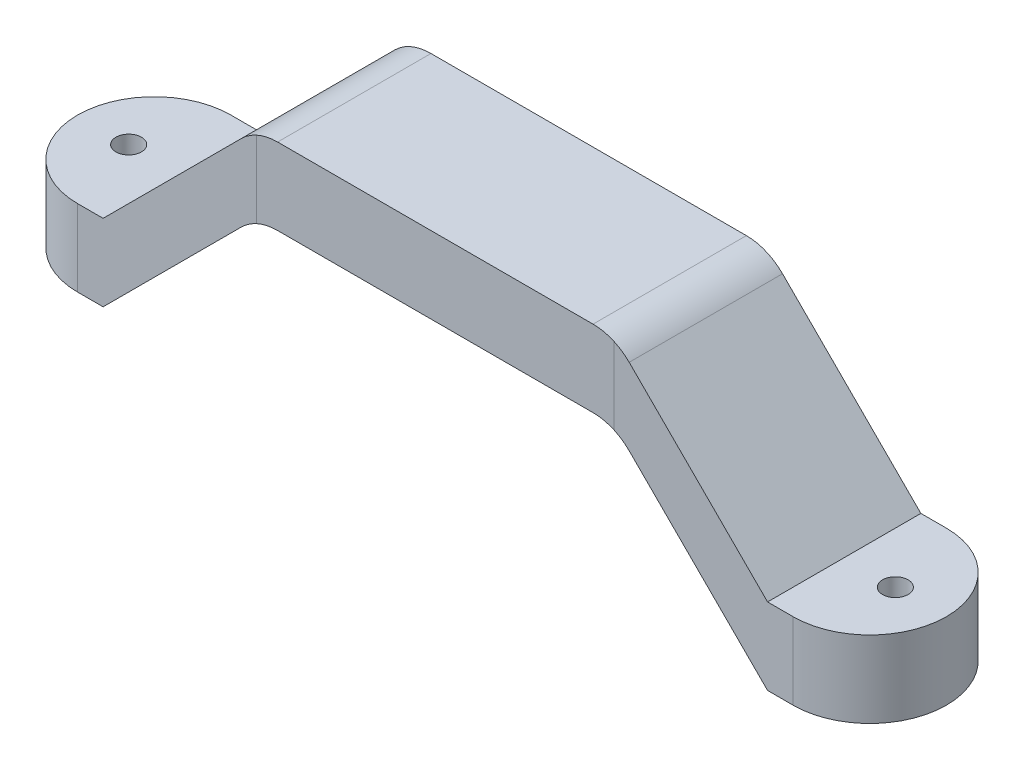
ISO-10303-21;
HEADER;
FILE_DESCRIPTION(('STEP AP214'),'2;1');
FILE_NAME('part.step','',(''),(''),'','','');
FILE_SCHEMA(('AUTOMOTIVE_DESIGN { 1 0 10303 214 1 1 1 1 }'));
ENDSEC;
DATA;
#1=APPLICATION_CONTEXT('core data for automotive mechanical design processes');
#2=APPLICATION_PROTOCOL_DEFINITION('international standard','automotive_design',2000,#1);
#3=PRODUCT_CONTEXT('',#1,'mechanical');
#4=PRODUCT('Part','Part','',(#3));
#5=PRODUCT_RELATED_PRODUCT_CATEGORY('part','',(#4));
#6=PRODUCT_DEFINITION_FORMATION('','',#4);
#7=PRODUCT_DEFINITION_CONTEXT('part definition',#1,'design');
#8=PRODUCT_DEFINITION('design','',#6,#7);
#9=PRODUCT_DEFINITION_SHAPE('','',#8);
#10=(LENGTH_UNIT() NAMED_UNIT(*) SI_UNIT(.MILLI.,.METRE.));
#11=(NAMED_UNIT(*) PLANE_ANGLE_UNIT() SI_UNIT($,.RADIAN.));
#12=(NAMED_UNIT(*) SI_UNIT($,.STERADIAN.) SOLID_ANGLE_UNIT());
#13=UNCERTAINTY_MEASURE_WITH_UNIT(LENGTH_MEASURE(1.E-05),#10,'distance_accuracy_value','');
#14=(GEOMETRIC_REPRESENTATION_CONTEXT(3) GLOBAL_UNCERTAINTY_ASSIGNED_CONTEXT((#13)) GLOBAL_UNIT_ASSIGNED_CONTEXT((#10,
#11,#12)) REPRESENTATION_CONTEXT('',''));
#15=CARTESIAN_POINT('',(0.,0.,0.));
#16=DIRECTION('',(0.,0.,1.));
#17=DIRECTION('',(1.,0.,0.));
#18=AXIS2_PLACEMENT_3D('',#15,#16,#17);
#19=CARTESIAN_POINT('',(38.1,28.575,-19.05));
#20=DIRECTION('',(0.,0.,-1.));
#21=DIRECTION('',(-1.,0.,0.));
#22=AXIS2_PLACEMENT_3D('',#19,#20,#21);
#23=PLANE('',#22);
#24=DIRECTION('',(1.,0.,0.));
#25=VECTOR('',#24,1.);
#26=CARTESIAN_POINT('',(38.1,47.625,-19.05));
#27=LINE('',#26,#25);
#28=CARTESIAN_POINT('',(43.3605122421383,47.625,-19.05));
#29=VERTEX_POINT('',#28);
#30=CARTESIAN_POINT('',(121.739487757862,47.625,-19.05));
#31=VERTEX_POINT('',#30);
#32=EDGE_CURVE('E300',#29,#31,#27,.T.);
#33=ORIENTED_EDGE('',*,*,#32,.T.);
#34=CARTESIAN_POINT('',(121.739487757862,34.925,-19.05));
#35=DIRECTION('',(0.,0.,-1.));
#36=DIRECTION('',(-1.,0.,0.));
#37=AXIS2_PLACEMENT_3D('',#34,#35,#36);
#38=CIRCLE('',#37,12.7);
#39=CARTESIAN_POINT('',(127.,46.4842824582806,-19.05));
#40=VERTEX_POINT('',#39);
#41=EDGE_CURVE('E335',#31,#40,#38,.T.);
#42=ORIENTED_EDGE('',*,*,#41,.T.);
#43=DIRECTION('',(0.,1.,0.));
#44=VECTOR('',#43,1.);
#45=CARTESIAN_POINT('',(127.,28.575,-19.05));
#46=LINE('',#45,#44);
#47=CARTESIAN_POINT('',(127.,27.4342824582806,-19.05));
#48=VERTEX_POINT('',#47);
#49=EDGE_CURVE('E214',#48,#40,#46,.T.);
#50=ORIENTED_EDGE('',*,*,#49,.F.);
#51=CARTESIAN_POINT('',(121.739487757862,15.875,-19.05));
#52=DIRECTION('',(0.,0.,-1.));
#53=DIRECTION('',(-1.,0.,0.));
#54=AXIS2_PLACEMENT_3D('',#51,#52,#53);
#55=CIRCLE('',#54,12.7);
#56=CARTESIAN_POINT('',(121.739487757862,28.575,-19.05));
#57=VERTEX_POINT('',#56);
#58=EDGE_CURVE('E367',#48,#57,#55,.F.);
#59=ORIENTED_EDGE('',*,*,#58,.T.);
#60=DIRECTION('',(1.,0.,0.));
#61=VECTOR('',#60,1.);
#62=CARTESIAN_POINT('',(38.1,28.575,-19.05));
#63=LINE('',#62,#61);
#64=CARTESIAN_POINT('',(43.3605122421383,28.575,-19.05));
#65=VERTEX_POINT('',#64);
#66=EDGE_CURVE('E269',#65,#57,#63,.T.);
#67=ORIENTED_EDGE('',*,*,#66,.F.);
#68=CARTESIAN_POINT('',(43.3605122421383,15.875,-19.05));
#69=DIRECTION('',(0.,0.,-1.));
#70=DIRECTION('',(-1.,0.,0.));
#71=AXIS2_PLACEMENT_3D('',#68,#69,#70);
#72=CIRCLE('',#71,12.7);
#73=CARTESIAN_POINT('',(38.1,27.4342824582806,-19.05));
#74=VERTEX_POINT('',#73);
#75=EDGE_CURVE('E377',#65,#74,#72,.F.);
#76=ORIENTED_EDGE('',*,*,#75,.T.);
#77=DIRECTION('',(0.,1.,0.));
#78=VECTOR('',#77,1.);
#79=CARTESIAN_POINT('',(38.1,28.575,-19.05));
#80=LINE('',#79,#78);
#81=CARTESIAN_POINT('',(38.1,46.4842824582806,-19.05));
#82=VERTEX_POINT('',#81);
#83=EDGE_CURVE('E68',#74,#82,#80,.T.);
#84=ORIENTED_EDGE('',*,*,#83,.T.);
#85=CARTESIAN_POINT('',(43.3605122421383,34.925,-19.05));
#86=DIRECTION('',(0.,0.,-1.));
#87=DIRECTION('',(-1.,0.,0.));
#88=AXIS2_PLACEMENT_3D('',#85,#86,#87);
#89=CIRCLE('',#88,12.7);
#90=EDGE_CURVE('E332',#82,#29,#89,.T.);
#91=ORIENTED_EDGE('',*,*,#90,.T.);
#92=EDGE_LOOP('',(#33,#42,#50,#59,#67,#76,#84,#91));
#93=FACE_BOUND('',#92,.T.);
#94=ADVANCED_FACE('F45',(#93),#23,.T.);
#95=CARTESIAN_POINT('',(38.1,47.625,19.05));
#96=DIRECTION('',(0.,1.,0.));
#97=DIRECTION('',(-1.,0.,0.));
#98=AXIS2_PLACEMENT_3D('',#95,#96,#97);
#99=PLANE('',#98);
#100=DIRECTION('',(1.,0.,0.));
#101=VECTOR('',#100,1.);
#102=CARTESIAN_POINT('',(38.1,47.625,19.05));
#103=LINE('',#102,#101);
#104=CARTESIAN_POINT('',(43.3605122421383,47.625,19.05));
#105=VERTEX_POINT('',#104);
#106=CARTESIAN_POINT('',(121.739487757862,47.625,19.05));
#107=VERTEX_POINT('',#106);
#108=EDGE_CURVE('E304',#105,#107,#103,.T.);
#109=ORIENTED_EDGE('',*,*,#108,.T.);
#110=DIRECTION('',(0.,0.,1.));
#111=VECTOR('',#110,1.);
#112=CARTESIAN_POINT('',(121.739487757862,47.625,19.05));
#113=LINE('',#112,#111);
#114=EDGE_CURVE('E329',#107,#31,#113,.F.);
#115=ORIENTED_EDGE('',*,*,#114,.T.);
#116=ORIENTED_EDGE('',*,*,#32,.F.);
#117=DIRECTION('',(0.,0.,1.));
#118=VECTOR('',#117,1.);
#119=CARTESIAN_POINT('',(43.3605122421383,47.625,19.05));
#120=LINE('',#119,#118);
#121=EDGE_CURVE('E325',#29,#105,#120,.T.);
#122=ORIENTED_EDGE('',*,*,#121,.T.);
#123=EDGE_LOOP('',(#109,#115,#116,#122));
#124=FACE_BOUND('',#123,.T.);
#125=ADVANCED_FACE('F414',(#124),#99,.T.);
#126=CARTESIAN_POINT('',(38.1,28.575,19.05));
#127=DIRECTION('',(0.,0.,1.));
#128=DIRECTION('',(1.,0.,0.));
#129=AXIS2_PLACEMENT_3D('',#126,#127,#128);
#130=PLANE('',#129);
#131=DIRECTION('',(0.,-1.,0.));
#132=VECTOR('',#131,1.);
#133=CARTESIAN_POINT('',(127.,28.575,19.05));
#134=LINE('',#133,#132);
#135=CARTESIAN_POINT('',(127.,46.4842824582806,19.05));
#136=VERTEX_POINT('',#135);
#137=CARTESIAN_POINT('',(127.,27.4342824582806,19.05));
#138=VERTEX_POINT('',#137);
#139=EDGE_CURVE('E218',#136,#138,#134,.T.);
#140=ORIENTED_EDGE('',*,*,#139,.F.);
#141=CARTESIAN_POINT('',(121.739487757862,34.925,19.05));
#142=DIRECTION('',(0.,0.,1.));
#143=DIRECTION('',(1.,0.,0.));
#144=AXIS2_PLACEMENT_3D('',#141,#142,#143);
#145=CIRCLE('',#144,12.7);
#146=EDGE_CURVE('E322',#136,#107,#145,.T.);
#147=ORIENTED_EDGE('',*,*,#146,.T.);
#148=ORIENTED_EDGE('',*,*,#108,.F.);
#149=CARTESIAN_POINT('',(43.3605122421383,34.925,19.05));
#150=DIRECTION('',(0.,0.,1.));
#151=DIRECTION('',(1.,0.,0.));
#152=AXIS2_PLACEMENT_3D('',#149,#150,#151);
#153=CIRCLE('',#152,12.7);
#154=CARTESIAN_POINT('',(38.1,46.4842824582806,19.05));
#155=VERTEX_POINT('',#154);
#156=EDGE_CURVE('E319',#105,#155,#153,.T.);
#157=ORIENTED_EDGE('',*,*,#156,.T.);
#158=DIRECTION('',(0.,-1.,0.));
#159=VECTOR('',#158,1.);
#160=CARTESIAN_POINT('',(38.1,28.575,19.05));
#161=LINE('',#160,#159);
#162=CARTESIAN_POINT('',(38.1,27.4342824582806,19.05));
#163=VERTEX_POINT('',#162);
#164=EDGE_CURVE('E60',#155,#163,#161,.T.);
#165=ORIENTED_EDGE('',*,*,#164,.T.);
#166=CARTESIAN_POINT('',(43.3605122421383,15.875,19.05));
#167=DIRECTION('',(0.,0.,1.));
#168=DIRECTION('',(1.,0.,0.));
#169=AXIS2_PLACEMENT_3D('',#166,#167,#168);
#170=CIRCLE('',#169,12.7);
#171=CARTESIAN_POINT('',(43.3605122421383,28.575,19.05));
#172=VERTEX_POINT('',#171);
#173=EDGE_CURVE('E11',#163,#172,#170,.F.);
#174=ORIENTED_EDGE('',*,*,#173,.T.);
#175=DIRECTION('',(1.,0.,0.));
#176=VECTOR('',#175,1.);
#177=CARTESIAN_POINT('',(38.1,28.575,19.05));
#178=LINE('',#177,#176);
#179=CARTESIAN_POINT('',(121.739487757862,28.575,19.05));
#180=VERTEX_POINT('',#179);
#181=EDGE_CURVE('E286',#172,#180,#178,.T.);
#182=ORIENTED_EDGE('',*,*,#181,.T.);
#183=CARTESIAN_POINT('',(121.739487757862,15.875,19.05));
#184=DIRECTION('',(0.,0.,1.));
#185=DIRECTION('',(1.,0.,0.));
#186=AXIS2_PLACEMENT_3D('',#183,#184,#185);
#187=CIRCLE('',#186,12.7);
#188=EDGE_CURVE('E370',#180,#138,#187,.F.);
#189=ORIENTED_EDGE('',*,*,#188,.T.);
#190=EDGE_LOOP('',(#140,#147,#148,#157,#165,#174,#182,#189));
#191=FACE_BOUND('',#190,.T.);
#192=ADVANCED_FACE('F394',(#191),#130,.T.);
#193=CARTESIAN_POINT('',(38.1,28.575,19.05));
#194=DIRECTION('',(0.,-1.,0.));
#195=DIRECTION('',(1.,0.,0.));
#196=AXIS2_PLACEMENT_3D('',#193,#194,#195);
#197=PLANE('',#196);
#198=ORIENTED_EDGE('',*,*,#66,.T.);
#199=DIRECTION('',(0.,0.,-1.));
#200=VECTOR('',#199,1.);
#201=CARTESIAN_POINT('',(121.739487757862,28.575,19.05));
#202=LINE('',#201,#200);
#203=EDGE_CURVE('E357',#57,#180,#202,.F.);
#204=ORIENTED_EDGE('',*,*,#203,.T.);
#205=ORIENTED_EDGE('',*,*,#181,.F.);
#206=DIRECTION('',(0.,0.,-1.));
#207=VECTOR('',#206,1.);
#208=CARTESIAN_POINT('',(43.3605122421383,28.575,-19.05));
#209=LINE('',#208,#207);
#210=EDGE_CURVE('E353',#172,#65,#209,.T.);
#211=ORIENTED_EDGE('',*,*,#210,.T.);
#212=EDGE_LOOP('',(#198,#204,#205,#211));
#213=FACE_BOUND('',#212,.T.);
#214=ADVANCED_FACE('F397',(#213),#197,.T.);
#215=CARTESIAN_POINT('',(0.,-9.525,-19.05));
#216=DIRECTION('',(0.,0.,-1.));
#217=DIRECTION('',(-1.,0.,0.));
#218=AXIS2_PLACEMENT_3D('',#215,#216,#217);
#219=PLANE('',#218);
#220=DIRECTION('',(0.707106781186547,0.707106781186548,0.));
#221=VECTOR('',#220,1.);
#222=CARTESIAN_POINT('',(0.,9.525,-19.05));
#223=LINE('',#222,#221);
#224=CARTESIAN_POINT('',(0.,9.525,-19.05));
#225=VERTEX_POINT('',#224);
#226=CARTESIAN_POINT('',(34.3802561210691,43.9052561210692,-19.05));
#227=VERTEX_POINT('',#226);
#228=EDGE_CURVE('E272',#225,#227,#223,.T.);
#229=ORIENTED_EDGE('',*,*,#228,.T.);
#230=CARTESIAN_POINT('',(43.3605122421383,34.925,-19.05));
#231=DIRECTION('',(0.,0.,-1.));
#232=DIRECTION('',(-1.,0.,0.));
#233=AXIS2_PLACEMENT_3D('',#230,#231,#232);
#234=CIRCLE('',#233,12.7);
#235=EDGE_CURVE('E346',#227,#82,#234,.T.);
#236=ORIENTED_EDGE('',*,*,#235,.T.);
#237=ORIENTED_EDGE('',*,*,#83,.F.);
#238=CARTESIAN_POINT('',(43.3605122421383,15.875,-19.05));
#239=DIRECTION('',(0.,0.,-1.));
#240=DIRECTION('',(-1.,0.,0.));
#241=AXIS2_PLACEMENT_3D('',#238,#239,#240);
#242=CIRCLE('',#241,12.7);
#243=CARTESIAN_POINT('',(34.3802561210691,24.8552561210692,-19.05));
#244=VERTEX_POINT('',#243);
#245=EDGE_CURVE('E380',#74,#244,#242,.F.);
#246=ORIENTED_EDGE('',*,*,#245,.T.);
#247=DIRECTION('',(0.707106781186547,0.707106781186548,0.));
#248=VECTOR('',#247,1.);
#249=CARTESIAN_POINT('',(0.,-9.525,-19.05));
#250=LINE('',#249,#248);
#251=CARTESIAN_POINT('',(0.,-9.525,-19.05));
#252=VERTEX_POINT('',#251);
#253=EDGE_CURVE('E273',#252,#244,#250,.T.);
#254=ORIENTED_EDGE('',*,*,#253,.F.);
#255=DIRECTION('',(-1.,0.,0.));
#256=VECTOR('',#255,1.);
#257=CARTESIAN_POINT('',(0.,-9.525,-19.05));
#258=LINE('',#257,#256);
#259=CARTESIAN_POINT('',(-6.35,-9.525,-19.05));
#260=VERTEX_POINT('',#259);
#261=EDGE_CURVE('E240',#252,#260,#258,.T.);
#262=ORIENTED_EDGE('',*,*,#261,.T.);
#263=DIRECTION('',(0.,-1.,0.));
#264=VECTOR('',#263,1.);
#265=CARTESIAN_POINT('',(-6.35,9.525,-19.05));
#266=LINE('',#265,#264);
#267=CARTESIAN_POINT('',(-6.35,9.525,-19.05));
#268=VERTEX_POINT('',#267);
#269=EDGE_CURVE('E265',#268,#260,#266,.T.);
#270=ORIENTED_EDGE('',*,*,#269,.F.);
#271=DIRECTION('',(-1.,0.,0.));
#272=VECTOR('',#271,1.);
#273=CARTESIAN_POINT('',(0.,9.525,-19.05));
#274=LINE('',#273,#272);
#275=EDGE_CURVE('E244',#225,#268,#274,.T.);
#276=ORIENTED_EDGE('',*,*,#275,.F.);
#277=EDGE_LOOP('',(#229,#236,#237,#246,#254,#262,#270,#276));
#278=FACE_BOUND('',#277,.T.);
#279=ADVANCED_FACE('F445',(#278),#219,.T.);
#280=CARTESIAN_POINT('',(0.,9.525,19.05));
#281=DIRECTION('',(-0.707106781186548,0.707106781186547,0.));
#282=DIRECTION('',(-0.707106781186547,-0.707106781186548,0.));
#283=AXIS2_PLACEMENT_3D('',#280,#281,#282);
#284=PLANE('',#283);
#285=DIRECTION('',(0.707106781186547,0.707106781186548,0.));
#286=VECTOR('',#285,1.);
#287=CARTESIAN_POINT('',(0.,9.525,19.05));
#288=LINE('',#287,#286);
#289=CARTESIAN_POINT('',(0.,9.525,19.05));
#290=VERTEX_POINT('',#289);
#291=CARTESIAN_POINT('',(34.3802561210691,43.9052561210692,19.05));
#292=VERTEX_POINT('',#291);
#293=EDGE_CURVE('E277',#290,#292,#288,.T.);
#294=ORIENTED_EDGE('',*,*,#293,.T.);
#295=DIRECTION('',(0.,0.,1.));
#296=VECTOR('',#295,1.);
#297=CARTESIAN_POINT('',(34.3802561210691,43.9052561210692,19.05));
#298=LINE('',#297,#296);
#299=EDGE_CURVE('E343',#292,#227,#298,.F.);
#300=ORIENTED_EDGE('',*,*,#299,.T.);
#301=ORIENTED_EDGE('',*,*,#228,.F.);
#302=DIRECTION('',(0.,0.,1.));
#303=VECTOR('',#302,1.);
#304=CARTESIAN_POINT('',(0.,9.525,19.05));
#305=LINE('',#304,#303);
#306=EDGE_CURVE('E282',#225,#290,#305,.T.);
#307=ORIENTED_EDGE('',*,*,#306,.T.);
#308=EDGE_LOOP('',(#294,#300,#301,#307));
#309=FACE_BOUND('',#308,.T.);
#310=ADVANCED_FACE('F425',(#309),#284,.T.);
#311=CARTESIAN_POINT('',(0.,-9.525,19.05));
#312=DIRECTION('',(0.,0.,1.));
#313=DIRECTION('',(1.,0.,0.));
#314=AXIS2_PLACEMENT_3D('',#311,#312,#313);
#315=PLANE('',#314);
#316=ORIENTED_EDGE('',*,*,#164,.F.);
#317=CARTESIAN_POINT('',(43.3605122421383,34.925,19.05));
#318=DIRECTION('',(0.,0.,1.));
#319=DIRECTION('',(1.,0.,0.));
#320=AXIS2_PLACEMENT_3D('',#317,#318,#319);
#321=CIRCLE('',#320,12.7);
#322=EDGE_CURVE('E340',#155,#292,#321,.T.);
#323=ORIENTED_EDGE('',*,*,#322,.T.);
#324=ORIENTED_EDGE('',*,*,#293,.F.);
#325=DIRECTION('',(1.,0.,0.));
#326=VECTOR('',#325,1.);
#327=CARTESIAN_POINT('',(0.,9.525,19.05));
#328=LINE('',#327,#326);
#329=CARTESIAN_POINT('',(-6.34999999999999,9.525,19.05));
#330=VERTEX_POINT('',#329);
#331=EDGE_CURVE('E251',#330,#290,#328,.T.);
#332=ORIENTED_EDGE('',*,*,#331,.F.);
#333=DIRECTION('',(0.,-1.,0.));
#334=VECTOR('',#333,1.);
#335=CARTESIAN_POINT('',(-6.34999999999999,9.525,19.05));
#336=LINE('',#335,#334);
#337=CARTESIAN_POINT('',(-6.34999999999999,-9.525,19.05));
#338=VERTEX_POINT('',#337);
#339=EDGE_CURVE('E254',#330,#338,#336,.T.);
#340=ORIENTED_EDGE('',*,*,#339,.T.);
#341=DIRECTION('',(1.,0.,0.));
#342=VECTOR('',#341,1.);
#343=CARTESIAN_POINT('',(0.,-9.525,19.05));
#344=LINE('',#343,#342);
#345=CARTESIAN_POINT('',(0.,-9.525,19.05));
#346=VERTEX_POINT('',#345);
#347=EDGE_CURVE('E248',#338,#346,#344,.T.);
#348=ORIENTED_EDGE('',*,*,#347,.T.);
#349=DIRECTION('',(0.707106781186547,0.707106781186548,0.));
#350=VECTOR('',#349,1.);
#351=CARTESIAN_POINT('',(0.,-9.525,19.05));
#352=LINE('',#351,#350);
#353=CARTESIAN_POINT('',(34.3802561210691,24.8552561210692,19.05));
#354=VERTEX_POINT('',#353);
#355=EDGE_CURVE('E292',#346,#354,#352,.T.);
#356=ORIENTED_EDGE('',*,*,#355,.T.);
#357=CARTESIAN_POINT('',(43.3605122421383,15.875,19.05));
#358=DIRECTION('',(0.,0.,1.));
#359=DIRECTION('',(1.,0.,0.));
#360=AXIS2_PLACEMENT_3D('',#357,#358,#359);
#361=CIRCLE('',#360,12.7);
#362=EDGE_CURVE('E54',#354,#163,#361,.F.);
#363=ORIENTED_EDGE('',*,*,#362,.T.);
#364=EDGE_LOOP('',(#316,#323,#324,#332,#340,#348,#356,#363));
#365=FACE_BOUND('',#364,.T.);
#366=ADVANCED_FACE('F386',(#365),#315,.T.);
#367=CARTESIAN_POINT('',(0.,-9.525,19.05));
#368=DIRECTION('',(0.707106781186548,-0.707106781186547,0.));
#369=DIRECTION('',(0.707106781186547,0.707106781186548,0.));
#370=AXIS2_PLACEMENT_3D('',#367,#368,#369);
#371=PLANE('',#370);
#372=ORIENTED_EDGE('',*,*,#253,.T.);
#373=DIRECTION('',(0.,0.,-1.));
#374=VECTOR('',#373,1.);
#375=CARTESIAN_POINT('',(34.3802561210691,24.8552561210692,19.05));
#376=LINE('',#375,#374);
#377=EDGE_CURVE('E360',#244,#354,#376,.F.);
#378=ORIENTED_EDGE('',*,*,#377,.T.);
#379=ORIENTED_EDGE('',*,*,#355,.F.);
#380=DIRECTION('',(0.,0.,-1.));
#381=VECTOR('',#380,1.);
#382=CARTESIAN_POINT('',(0.,-9.525,19.05));
#383=LINE('',#382,#381);
#384=EDGE_CURVE('E281',#346,#252,#383,.T.);
#385=ORIENTED_EDGE('',*,*,#384,.T.);
#386=EDGE_LOOP('',(#372,#378,#379,#385));
#387=FACE_BOUND('',#386,.T.);
#388=ADVANCED_FACE('F443',(#387),#371,.T.);
#389=CARTESIAN_POINT('',(-6.35,9.525,0.));
#390=DIRECTION('',(0.,-1.,0.));
#391=DIRECTION('',(0.,0.,-1.));
#392=AXIS2_PLACEMENT_3D('',#389,#390,#391);
#393=PLANE('',#392);
#394=ORIENTED_EDGE('',*,*,#306,.F.);
#395=ORIENTED_EDGE('',*,*,#275,.T.);
#396=CARTESIAN_POINT('',(-6.35,9.525,0.));
#397=DIRECTION('',(0.,1.,0.));
#398=DIRECTION('',(0.,0.,-1.));
#399=AXIS2_PLACEMENT_3D('',#396,#397,#398);
#400=CIRCLE('',#399,19.05);
#401=EDGE_CURVE('E247',#268,#330,#400,.T.);
#402=ORIENTED_EDGE('',*,*,#401,.T.);
#403=ORIENTED_EDGE('',*,*,#331,.T.);
#404=EDGE_LOOP('',(#394,#395,#402,#403));
#405=FACE_BOUND('',#404,.T.);
#406=CARTESIAN_POINT('',(-12.7,9.525,0.));
#407=DIRECTION('',(0.,1.,0.));
#408=DIRECTION('',(0.,0.,1.));
#409=AXIS2_PLACEMENT_3D('',#406,#407,#408);
#410=CIRCLE('',#409,3.175);
#411=CARTESIAN_POINT('',(-12.7,9.525,-3.175));
#412=VERTEX_POINT('',#411);
#413=EDGE_CURVE('E236',#412,#412,#410,.T.);
#414=ORIENTED_EDGE('',*,*,#413,.F.);
#415=EDGE_LOOP('',(#414));
#416=FACE_BOUND('',#415,.T.);
#417=ADVANCED_FACE('F429',(#405,#416),#393,.F.);
#418=CARTESIAN_POINT('',(-6.35,-9.525,0.));
#419=DIRECTION('',(0.,-1.,0.));
#420=DIRECTION('',(0.,0.,-1.));
#421=AXIS2_PLACEMENT_3D('',#418,#419,#420);
#422=PLANE('',#421);
#423=ORIENTED_EDGE('',*,*,#384,.F.);
#424=ORIENTED_EDGE('',*,*,#347,.F.);
#425=CARTESIAN_POINT('',(-6.35,-9.525,0.));
#426=DIRECTION('',(0.,1.,0.));
#427=DIRECTION('',(0.,0.,-1.));
#428=AXIS2_PLACEMENT_3D('',#425,#426,#427);
#429=CIRCLE('',#428,19.05);
#430=EDGE_CURVE('E257',#260,#338,#429,.T.);
#431=ORIENTED_EDGE('',*,*,#430,.F.);
#432=ORIENTED_EDGE('',*,*,#261,.F.);
#433=EDGE_LOOP('',(#423,#424,#431,#432));
#434=FACE_BOUND('',#433,.T.);
#435=CARTESIAN_POINT('',(-12.7,-9.525,0.));
#436=DIRECTION('',(0.,1.,0.));
#437=DIRECTION('',(0.,0.,1.));
#438=AXIS2_PLACEMENT_3D('',#435,#436,#437);
#439=CIRCLE('',#438,3.175);
#440=CARTESIAN_POINT('',(-12.7,-9.525,-3.175));
#441=VERTEX_POINT('',#440);
#442=EDGE_CURVE('E233',#441,#441,#439,.T.);
#443=ORIENTED_EDGE('',*,*,#442,.T.);
#444=EDGE_LOOP('',(#443));
#445=FACE_BOUND('',#444,.T.);
#446=ADVANCED_FACE('F439',(#434,#445),#422,.T.);
#447=CARTESIAN_POINT('',(-6.35,9.525,0.));
#448=DIRECTION('',(0.,-1.,0.));
#449=DIRECTION('',(0.,0.,-1.));
#450=AXIS2_PLACEMENT_3D('',#447,#448,#449);
#451=CYLINDRICAL_SURFACE('',#450,19.05);
#452=ORIENTED_EDGE('',*,*,#430,.T.);
#453=ORIENTED_EDGE('',*,*,#339,.F.);
#454=ORIENTED_EDGE('',*,*,#401,.F.);
#455=ORIENTED_EDGE('',*,*,#269,.T.);
#456=EDGE_LOOP('',(#452,#453,#454,#455));
#457=FACE_BOUND('',#456,.T.);
#458=ADVANCED_FACE('F446',(#457),#451,.T.);
#459=CARTESIAN_POINT('',(-12.7,9.525,0.));
#460=DIRECTION('',(0.,-1.,0.));
#461=DIRECTION('',(0.,0.,-1.));
#462=AXIS2_PLACEMENT_3D('',#459,#460,#461);
#463=CYLINDRICAL_SURFACE('',#462,3.175);
#464=CARTESIAN_POINT('',(-12.7,9.525,-3.175));
#465=CARTESIAN_POINT('',(-12.7,9.3265625,-3.175));
#466=CARTESIAN_POINT('',(-12.7,9.128125,-3.175));
#467=CARTESIAN_POINT('',(-12.7,8.73125,-3.175));
#468=CARTESIAN_POINT('',(-12.7,8.5328125,-3.175));
#469=CARTESIAN_POINT('',(-12.7,8.1359375,-3.175));
#470=CARTESIAN_POINT('',(-12.7,7.9375,-3.175));
#471=CARTESIAN_POINT('',(-12.7,7.540625,-3.175));
#472=CARTESIAN_POINT('',(-12.7,7.3421875,-3.175));
#473=CARTESIAN_POINT('',(-12.7,6.9453125,-3.175));
#474=CARTESIAN_POINT('',(-12.7,6.746875,-3.175));
#475=CARTESIAN_POINT('',(-12.7,6.35,-3.175));
#476=CARTESIAN_POINT('',(-12.7,6.1515625,-3.175));
#477=CARTESIAN_POINT('',(-12.7,5.7546875,-3.175));
#478=CARTESIAN_POINT('',(-12.7,5.55625,-3.175));
#479=CARTESIAN_POINT('',(-12.7,5.159375,-3.175));
#480=CARTESIAN_POINT('',(-12.7,4.9609375,-3.175));
#481=CARTESIAN_POINT('',(-12.7,4.5640625,-3.175));
#482=CARTESIAN_POINT('',(-12.7,4.365625,-3.175));
#483=CARTESIAN_POINT('',(-12.7,3.96875,-3.175));
#484=CARTESIAN_POINT('',(-12.7,3.7703125,-3.175));
#485=CARTESIAN_POINT('',(-12.7,3.3734375,-3.175));
#486=CARTESIAN_POINT('',(-12.7,3.175,-3.175));
#487=CARTESIAN_POINT('',(-12.7,2.778125,-3.175));
#488=CARTESIAN_POINT('',(-12.7,2.5796875,-3.175));
#489=CARTESIAN_POINT('',(-12.7,2.1828125,-3.175));
#490=CARTESIAN_POINT('',(-12.7,1.984375,-3.175));
#491=CARTESIAN_POINT('',(-12.7,1.5875,-3.175));
#492=CARTESIAN_POINT('',(-12.7,1.3890625,-3.175));
#493=CARTESIAN_POINT('',(-12.7,0.992187499999997,-3.175));
#494=CARTESIAN_POINT('',(-12.7,0.793749999999997,-3.175));
#495=CARTESIAN_POINT('',(-12.7,0.396874999999997,-3.175));
#496=CARTESIAN_POINT('',(-12.7,0.198437499999997,-3.175));
#497=CARTESIAN_POINT('',(-12.7,-0.198437500000004,-3.175));
#498=CARTESIAN_POINT('',(-12.7,-0.396875000000004,-3.175));
#499=CARTESIAN_POINT('',(-12.7,-0.793750000000004,-3.175));
#500=CARTESIAN_POINT('',(-12.7,-0.992187500000004,-3.175));
#501=CARTESIAN_POINT('',(-12.7,-1.3890625,-3.175));
#502=CARTESIAN_POINT('',(-12.7,-1.5875,-3.175));
#503=CARTESIAN_POINT('',(-12.7,-1.984375,-3.175));
#504=CARTESIAN_POINT('',(-12.7,-2.1828125,-3.175));
#505=CARTESIAN_POINT('',(-12.7,-2.5796875,-3.175));
#506=CARTESIAN_POINT('',(-12.7,-2.778125,-3.175));
#507=CARTESIAN_POINT('',(-12.7,-3.175,-3.175));
#508=CARTESIAN_POINT('',(-12.7,-3.3734375,-3.175));
#509=CARTESIAN_POINT('',(-12.7,-3.7703125,-3.175));
#510=CARTESIAN_POINT('',(-12.7,-3.96875,-3.175));
#511=CARTESIAN_POINT('',(-12.7,-4.365625,-3.175));
#512=CARTESIAN_POINT('',(-12.7,-4.5640625,-3.175));
#513=CARTESIAN_POINT('',(-12.7,-4.9609375,-3.175));
#514=CARTESIAN_POINT('',(-12.7,-5.15937500000001,-3.175));
#515=CARTESIAN_POINT('',(-12.7,-5.55625,-3.175));
#516=CARTESIAN_POINT('',(-12.7,-5.75468750000001,-3.175));
#517=CARTESIAN_POINT('',(-12.7,-6.1515625,-3.175));
#518=CARTESIAN_POINT('',(-12.7,-6.35,-3.175));
#519=CARTESIAN_POINT('',(-12.7,-6.746875,-3.175));
#520=CARTESIAN_POINT('',(-12.7,-6.9453125,-3.175));
#521=CARTESIAN_POINT('',(-12.7,-7.3421875,-3.175));
#522=CARTESIAN_POINT('',(-12.7,-7.540625,-3.175));
#523=CARTESIAN_POINT('',(-12.7,-7.9375,-3.175));
#524=CARTESIAN_POINT('',(-12.7,-8.1359375,-3.175));
#525=CARTESIAN_POINT('',(-12.7,-8.5328125,-3.175));
#526=CARTESIAN_POINT('',(-12.7,-8.73125,-3.175));
#527=CARTESIAN_POINT('',(-12.7,-9.128125,-3.175));
#528=CARTESIAN_POINT('',(-12.7,-9.3265625,-3.175));
#529=CARTESIAN_POINT('',(-12.7,-9.525,-3.175));
#530=B_SPLINE_CURVE_WITH_KNOTS('',3,(#464,#465,#466,#467,#468,#469,#470,#471,#472,#473,#474,
#475,#476,#477,#478,#479,#480,#481,#482,#483,#484,#485,#486,#487,#488,#489,#490,#491,#492,#493,
#494,#495,#496,#497,#498,#499,#500,#501,#502,#503,#504,#505,#506,#507,#508,#509,#510,#511,#512,
#513,#514,#515,#516,#517,#518,#519,#520,#521,#522,#523,#524,#525,#526,#527,#528,#529),
.UNSPECIFIED.,.F.,.F.,(4,2,2,2,2,2,2,2,2,2,2,2,2,2,2,2,2,2,2,2,2,2,2,2,2,2,2,2,2,2,2,2,4),(0.,
0.595312499999999,1.190625,1.7859375,2.38125,2.9765625,3.571875,4.1671875,4.7625,5.3578125,
5.953125,6.5484375,7.14375,7.7390625,8.334375,8.9296875,9.525,10.1203125,10.715625,11.3109375,
11.90625,12.5015625,13.096875,13.6921875,14.2875,14.8828125,15.478125,16.0734375,16.66875,
17.2640625,17.859375,18.4546875,19.05),.UNSPECIFIED.);
#531=EDGE_CURVE('BSEAM448',#412,#441,#530,.T.);
#532=ORIENTED_EDGE('',*,*,#413,.T.);
#533=ORIENTED_EDGE('',*,*,#442,.F.);
#534=ORIENTED_EDGE('',*,*,#531,.T.);
#535=ORIENTED_EDGE('',*,*,#531,.F.);
#536=EDGE_LOOP('',(#532,#534,#533,#535));
#537=FACE_BOUND('',#536,.T.);
#538=ADVANCED_FACE('F448',(#537),#463,.F.);
#539=CARTESIAN_POINT('',(165.1,-9.525,-19.05));
#540=DIRECTION('',(0.,0.,-1.));
#541=DIRECTION('',(1.,0.,0.));
#542=AXIS2_PLACEMENT_3D('',#539,#540,#541);
#543=PLANE('',#542);
#544=ORIENTED_EDGE('',*,*,#49,.T.);
#545=CARTESIAN_POINT('',(121.739487757862,34.925,-19.05));
#546=DIRECTION('',(0.,0.,-1.));
#547=DIRECTION('',(-1.,0.,0.));
#548=AXIS2_PLACEMENT_3D('',#545,#546,#547);
#549=CIRCLE('',#548,12.7);
#550=CARTESIAN_POINT('',(130.719743878931,43.9052561210691,-19.05));
#551=VERTEX_POINT('',#550);
#552=EDGE_CURVE('E212',#40,#551,#549,.T.);
#553=ORIENTED_EDGE('',*,*,#552,.T.);
#554=DIRECTION('',(-0.707106781186547,0.707106781186548,0.));
#555=VECTOR('',#554,1.);
#556=CARTESIAN_POINT('',(165.1,9.525,-19.05));
#557=LINE('',#556,#555);
#558=CARTESIAN_POINT('',(165.1,9.525,-19.05));
#559=VERTEX_POINT('',#558);
#560=EDGE_CURVE('E188',#559,#551,#557,.T.);
#561=ORIENTED_EDGE('',*,*,#560,.F.);
#562=DIRECTION('',(1.,0.,0.));
#563=VECTOR('',#562,1.);
#564=CARTESIAN_POINT('',(165.1,9.525,-19.05));
#565=LINE('',#564,#563);
#566=CARTESIAN_POINT('',(171.45,9.525,-19.05));
#567=VERTEX_POINT('',#566);
#568=EDGE_CURVE('E199',#559,#567,#565,.T.);
#569=ORIENTED_EDGE('',*,*,#568,.T.);
#570=DIRECTION('',(0.,-1.,0.));
#571=VECTOR('',#570,1.);
#572=CARTESIAN_POINT('',(171.45,9.525,-19.05));
#573=LINE('',#572,#571);
#574=CARTESIAN_POINT('',(171.45,-9.525,-19.05));
#575=VERTEX_POINT('',#574);
#576=EDGE_CURVE('E196',#567,#575,#573,.T.);
#577=ORIENTED_EDGE('',*,*,#576,.T.);
#578=DIRECTION('',(1.,0.,0.));
#579=VECTOR('',#578,1.);
#580=CARTESIAN_POINT('',(165.1,-9.525,-19.05));
#581=LINE('',#580,#579);
#582=CARTESIAN_POINT('',(165.1,-9.525,-19.05));
#583=VERTEX_POINT('',#582);
#584=EDGE_CURVE('E684',#583,#575,#581,.T.);
#585=ORIENTED_EDGE('',*,*,#584,.F.);
#586=DIRECTION('',(-0.707106781186547,0.707106781186548,0.));
#587=VECTOR('',#586,1.);
#588=CARTESIAN_POINT('',(165.1,-9.525,-19.05));
#589=LINE('',#588,#587);
#590=CARTESIAN_POINT('',(130.719743878931,24.8552561210691,-19.05));
#591=VERTEX_POINT('',#590);
#592=EDGE_CURVE('E220',#583,#591,#589,.T.);
#593=ORIENTED_EDGE('',*,*,#592,.T.);
#594=CARTESIAN_POINT('',(121.739487757862,15.875,-19.05));
#595=DIRECTION('',(0.,0.,-1.));
#596=DIRECTION('',(-1.,0.,0.));
#597=AXIS2_PLACEMENT_3D('',#594,#595,#596);
#598=CIRCLE('',#597,12.7);
#599=EDGE_CURVE('E363',#591,#48,#598,.F.);
#600=ORIENTED_EDGE('',*,*,#599,.T.);
#601=EDGE_LOOP('',(#544,#553,#561,#569,#577,#585,#593,#600));
#602=FACE_BOUND('',#601,.T.);
#603=ADVANCED_FACE('F210',(#602),#543,.T.);
#604=CARTESIAN_POINT('',(165.1,9.525,19.05));
#605=DIRECTION('',(0.707106781186548,0.707106781186547,0.));
#606=DIRECTION('',(0.707106781186547,-0.707106781186548,0.));
#607=AXIS2_PLACEMENT_3D('',#604,#605,#606);
#608=PLANE('',#607);
#609=ORIENTED_EDGE('',*,*,#560,.T.);
#610=DIRECTION('',(0.,0.,1.));
#611=VECTOR('',#610,1.);
#612=CARTESIAN_POINT('',(130.719743878931,43.9052561210691,19.05));
#613=LINE('',#612,#611);
#614=CARTESIAN_POINT('',(130.719743878931,43.9052561210691,19.05));
#615=VERTEX_POINT('',#614);
#616=EDGE_CURVE('E296',#551,#615,#613,.T.);
#617=ORIENTED_EDGE('',*,*,#616,.T.);
#618=DIRECTION('',(-0.707106781186547,0.707106781186548,0.));
#619=VECTOR('',#618,1.);
#620=CARTESIAN_POINT('',(165.1,9.525,19.05));
#621=LINE('',#620,#619);
#622=CARTESIAN_POINT('',(165.1,9.525,19.05));
#623=VERTEX_POINT('',#622);
#624=EDGE_CURVE('E191',#623,#615,#621,.T.);
#625=ORIENTED_EDGE('',*,*,#624,.F.);
#626=DIRECTION('',(0.,0.,1.));
#627=VECTOR('',#626,1.);
#628=CARTESIAN_POINT('',(165.1,9.525,19.05));
#629=LINE('',#628,#627);
#630=EDGE_CURVE('E183',#559,#623,#629,.T.);
#631=ORIENTED_EDGE('',*,*,#630,.F.);
#632=EDGE_LOOP('',(#609,#617,#625,#631));
#633=FACE_BOUND('',#632,.T.);
#634=ADVANCED_FACE('F185',(#633),#608,.T.);
#635=CARTESIAN_POINT('',(165.1,-9.525,19.05));
#636=DIRECTION('',(0.,0.,1.));
#637=DIRECTION('',(-1.,0.,0.));
#638=AXIS2_PLACEMENT_3D('',#635,#636,#637);
#639=PLANE('',#638);
#640=ORIENTED_EDGE('',*,*,#624,.T.);
#641=CARTESIAN_POINT('',(121.739487757862,34.925,19.05));
#642=DIRECTION('',(0.,0.,1.));
#643=DIRECTION('',(1.,0.,0.));
#644=AXIS2_PLACEMENT_3D('',#641,#642,#643);
#645=CIRCLE('',#644,12.7);
#646=EDGE_CURVE('E316',#615,#136,#645,.T.);
#647=ORIENTED_EDGE('',*,*,#646,.T.);
#648=ORIENTED_EDGE('',*,*,#139,.T.);
#649=CARTESIAN_POINT('',(121.739487757862,15.875,19.05));
#650=DIRECTION('',(0.,0.,1.));
#651=DIRECTION('',(1.,0.,0.));
#652=AXIS2_PLACEMENT_3D('',#649,#650,#651);
#653=CIRCLE('',#652,12.7);
#654=CARTESIAN_POINT('',(130.719743878931,24.8552561210691,19.05));
#655=VERTEX_POINT('',#654);
#656=EDGE_CURVE('E374',#138,#655,#653,.F.);
#657=ORIENTED_EDGE('',*,*,#656,.T.);
#658=DIRECTION('',(-0.707106781186547,0.707106781186548,0.));
#659=VECTOR('',#658,1.);
#660=CARTESIAN_POINT('',(165.1,-9.525,19.05));
#661=LINE('',#660,#659);
#662=CARTESIAN_POINT('',(165.1,-9.525,19.05));
#663=VERTEX_POINT('',#662);
#664=EDGE_CURVE('E229',#663,#655,#661,.T.);
#665=ORIENTED_EDGE('',*,*,#664,.F.);
#666=DIRECTION('',(-1.,0.,0.));
#667=VECTOR('',#666,1.);
#668=CARTESIAN_POINT('',(165.1,-9.525,19.05));
#669=LINE('',#668,#667);
#670=CARTESIAN_POINT('',(171.45,-9.525,19.05));
#671=VERTEX_POINT('',#670);
#672=EDGE_CURVE('E207',#671,#663,#669,.T.);
#673=ORIENTED_EDGE('',*,*,#672,.F.);
#674=DIRECTION('',(0.,-1.,0.));
#675=VECTOR('',#674,1.);
#676=CARTESIAN_POINT('',(171.45,9.525,19.05));
#677=LINE('',#676,#675);
#678=CARTESIAN_POINT('',(171.45,9.525,19.05));
#679=VERTEX_POINT('',#678);
#680=EDGE_CURVE('E676',#679,#671,#677,.T.);
#681=ORIENTED_EDGE('',*,*,#680,.F.);
#682=DIRECTION('',(-1.,0.,0.));
#683=VECTOR('',#682,1.);
#684=CARTESIAN_POINT('',(165.1,9.525,19.05));
#685=LINE('',#684,#683);
#686=EDGE_CURVE('E673',#679,#623,#685,.T.);
#687=ORIENTED_EDGE('',*,*,#686,.T.);
#688=EDGE_LOOP('',(#640,#647,#648,#657,#665,#673,#681,#687));
#689=FACE_BOUND('',#688,.T.);
#690=ADVANCED_FACE('F552',(#689),#639,.T.);
#691=CARTESIAN_POINT('',(165.1,-9.525,19.05));
#692=DIRECTION('',(-0.707106781186548,-0.707106781186547,0.));
#693=DIRECTION('',(-0.707106781186547,0.707106781186548,0.));
#694=AXIS2_PLACEMENT_3D('',#691,#692,#693);
#695=PLANE('',#694);
#696=ORIENTED_EDGE('',*,*,#664,.T.);
#697=DIRECTION('',(0.,0.,-1.));
#698=VECTOR('',#697,1.);
#699=CARTESIAN_POINT('',(130.719743878931,24.8552561210691,-19.05));
#700=LINE('',#699,#698);
#701=EDGE_CURVE('E349',#655,#591,#700,.T.);
#702=ORIENTED_EDGE('',*,*,#701,.T.);
#703=ORIENTED_EDGE('',*,*,#592,.F.);
#704=DIRECTION('',(0.,0.,-1.));
#705=VECTOR('',#704,1.);
#706=CARTESIAN_POINT('',(165.1,-9.525,19.05));
#707=LINE('',#706,#705);
#708=EDGE_CURVE('E195',#663,#583,#707,.T.);
#709=ORIENTED_EDGE('',*,*,#708,.F.);
#710=EDGE_LOOP('',(#696,#702,#703,#709));
#711=FACE_BOUND('',#710,.T.);
#712=ADVANCED_FACE('F543',(#711),#695,.T.);
#713=CARTESIAN_POINT('',(171.45,9.525,0.));
#714=DIRECTION('',(0.,-1.,0.));
#715=DIRECTION('',(0.,0.,-1.));
#716=AXIS2_PLACEMENT_3D('',#713,#714,#715);
#717=PLANE('',#716);
#718=ORIENTED_EDGE('',*,*,#630,.T.);
#719=ORIENTED_EDGE('',*,*,#686,.F.);
#720=CARTESIAN_POINT('',(171.45,9.525,0.));
#721=DIRECTION('',(0.,-1.,0.));
#722=DIRECTION('',(0.,0.,-1.));
#723=AXIS2_PLACEMENT_3D('',#720,#721,#722);
#724=CIRCLE('',#723,19.05);
#725=EDGE_CURVE('E202',#567,#679,#724,.T.);
#726=ORIENTED_EDGE('',*,*,#725,.F.);
#727=ORIENTED_EDGE('',*,*,#568,.F.);
#728=EDGE_LOOP('',(#718,#719,#726,#727));
#729=FACE_BOUND('',#728,.T.);
#730=CARTESIAN_POINT('',(177.8,9.525,0.));
#731=DIRECTION('',(0.,-1.,0.));
#732=DIRECTION('',(0.,0.,1.));
#733=AXIS2_PLACEMENT_3D('',#730,#731,#732);
#734=CIRCLE('',#733,3.175);
#735=CARTESIAN_POINT('',(177.8,9.525,-3.175));
#736=VERTEX_POINT('',#735);
#737=EDGE_CURVE('E689',#736,#736,#734,.T.);
#738=ORIENTED_EDGE('',*,*,#737,.T.);
#739=EDGE_LOOP('',(#738));
#740=FACE_BOUND('',#739,.T.);
#741=ADVANCED_FACE('F200',(#729,#740),#717,.F.);
#742=CARTESIAN_POINT('',(171.45,-9.525,0.));
#743=DIRECTION('',(0.,-1.,0.));
#744=DIRECTION('',(0.,0.,-1.));
#745=AXIS2_PLACEMENT_3D('',#742,#743,#744);
#746=PLANE('',#745);
#747=ORIENTED_EDGE('',*,*,#708,.T.);
#748=ORIENTED_EDGE('',*,*,#584,.T.);
#749=CARTESIAN_POINT('',(171.45,-9.525,0.));
#750=DIRECTION('',(0.,-1.,0.));
#751=DIRECTION('',(0.,0.,-1.));
#752=AXIS2_PLACEMENT_3D('',#749,#750,#751);
#753=CIRCLE('',#752,19.05);
#754=EDGE_CURVE('E688',#575,#671,#753,.T.);
#755=ORIENTED_EDGE('',*,*,#754,.T.);
#756=ORIENTED_EDGE('',*,*,#672,.T.);
#757=EDGE_LOOP('',(#747,#748,#755,#756));
#758=FACE_BOUND('',#757,.T.);
#759=CARTESIAN_POINT('',(177.8,-9.525,0.));
#760=DIRECTION('',(0.,-1.,0.));
#761=DIRECTION('',(0.,0.,1.));
#762=AXIS2_PLACEMENT_3D('',#759,#760,#761);
#763=CIRCLE('',#762,3.175);
#764=CARTESIAN_POINT('',(177.8,-9.525,-3.175));
#765=VERTEX_POINT('',#764);
#766=EDGE_CURVE('E701',#765,#765,#763,.T.);
#767=ORIENTED_EDGE('',*,*,#766,.F.);
#768=EDGE_LOOP('',(#767));
#769=FACE_BOUND('',#768,.T.);
#770=ADVANCED_FACE('F524',(#758,#769),#746,.T.);
#771=CARTESIAN_POINT('',(171.45,9.525,0.));
#772=DIRECTION('',(0.,-1.,0.));
#773=DIRECTION('',(0.,0.,-1.));
#774=AXIS2_PLACEMENT_3D('',#771,#772,#773);
#775=CYLINDRICAL_SURFACE('',#774,19.05);
#776=ORIENTED_EDGE('',*,*,#754,.F.);
#777=ORIENTED_EDGE('',*,*,#576,.F.);
#778=ORIENTED_EDGE('',*,*,#725,.T.);
#779=ORIENTED_EDGE('',*,*,#680,.T.);
#780=EDGE_LOOP('',(#776,#777,#778,#779));
#781=FACE_BOUND('',#780,.T.);
#782=ADVANCED_FACE('F514',(#781),#775,.T.);
#783=CARTESIAN_POINT('',(177.8,9.525,0.));
#784=DIRECTION('',(0.,-1.,0.));
#785=DIRECTION('',(0.,0.,-1.));
#786=AXIS2_PLACEMENT_3D('',#783,#784,#785);
#787=CYLINDRICAL_SURFACE('',#786,3.175);
#788=CARTESIAN_POINT('',(177.8,9.525,-3.175));
#789=CARTESIAN_POINT('',(177.8,9.3265625,-3.175));
#790=CARTESIAN_POINT('',(177.8,9.128125,-3.175));
#791=CARTESIAN_POINT('',(177.8,8.73125,-3.175));
#792=CARTESIAN_POINT('',(177.8,8.5328125,-3.175));
#793=CARTESIAN_POINT('',(177.8,8.1359375,-3.175));
#794=CARTESIAN_POINT('',(177.8,7.9375,-3.175));
#795=CARTESIAN_POINT('',(177.8,7.540625,-3.175));
#796=CARTESIAN_POINT('',(177.8,7.3421875,-3.175));
#797=CARTESIAN_POINT('',(177.8,6.9453125,-3.175));
#798=CARTESIAN_POINT('',(177.8,6.746875,-3.175));
#799=CARTESIAN_POINT('',(177.8,6.35,-3.175));
#800=CARTESIAN_POINT('',(177.8,6.1515625,-3.175));
#801=CARTESIAN_POINT('',(177.8,5.7546875,-3.175));
#802=CARTESIAN_POINT('',(177.8,5.55625,-3.175));
#803=CARTESIAN_POINT('',(177.8,5.159375,-3.175));
#804=CARTESIAN_POINT('',(177.8,4.9609375,-3.175));
#805=CARTESIAN_POINT('',(177.8,4.5640625,-3.175));
#806=CARTESIAN_POINT('',(177.8,4.365625,-3.175));
#807=CARTESIAN_POINT('',(177.8,3.96875,-3.175));
#808=CARTESIAN_POINT('',(177.8,3.7703125,-3.175));
#809=CARTESIAN_POINT('',(177.8,3.3734375,-3.175));
#810=CARTESIAN_POINT('',(177.8,3.175,-3.175));
#811=CARTESIAN_POINT('',(177.8,2.778125,-3.175));
#812=CARTESIAN_POINT('',(177.8,2.5796875,-3.175));
#813=CARTESIAN_POINT('',(177.8,2.1828125,-3.175));
#814=CARTESIAN_POINT('',(177.8,1.984375,-3.175));
#815=CARTESIAN_POINT('',(177.8,1.5875,-3.175));
#816=CARTESIAN_POINT('',(177.8,1.3890625,-3.175));
#817=CARTESIAN_POINT('',(177.8,0.992187500000001,-3.175));
#818=CARTESIAN_POINT('',(177.8,0.793750000000001,-3.175));
#819=CARTESIAN_POINT('',(177.8,0.396875,-3.175));
#820=CARTESIAN_POINT('',(177.8,0.1984375,-3.175));
#821=CARTESIAN_POINT('',(177.8,-0.1984375,-3.175));
#822=CARTESIAN_POINT('',(177.8,-0.396875,-3.175));
#823=CARTESIAN_POINT('',(177.8,-0.793750000000001,-3.175));
#824=CARTESIAN_POINT('',(177.8,-0.992187500000001,-3.175));
#825=CARTESIAN_POINT('',(177.8,-1.3890625,-3.175));
#826=CARTESIAN_POINT('',(177.8,-1.5875,-3.175));
#827=CARTESIAN_POINT('',(177.8,-1.984375,-3.175));
#828=CARTESIAN_POINT('',(177.8,-2.1828125,-3.175));
#829=CARTESIAN_POINT('',(177.8,-2.5796875,-3.175));
#830=CARTESIAN_POINT('',(177.8,-2.778125,-3.175));
#831=CARTESIAN_POINT('',(177.8,-3.175,-3.175));
#832=CARTESIAN_POINT('',(177.8,-3.3734375,-3.175));
#833=CARTESIAN_POINT('',(177.8,-3.7703125,-3.175));
#834=CARTESIAN_POINT('',(177.8,-3.96875,-3.175));
#835=CARTESIAN_POINT('',(177.8,-4.365625,-3.175));
#836=CARTESIAN_POINT('',(177.8,-4.5640625,-3.175));
#837=CARTESIAN_POINT('',(177.8,-4.9609375,-3.175));
#838=CARTESIAN_POINT('',(177.8,-5.159375,-3.175));
#839=CARTESIAN_POINT('',(177.8,-5.55625,-3.175));
#840=CARTESIAN_POINT('',(177.8,-5.7546875,-3.175));
#841=CARTESIAN_POINT('',(177.8,-6.1515625,-3.175));
#842=CARTESIAN_POINT('',(177.8,-6.35,-3.175));
#843=CARTESIAN_POINT('',(177.8,-6.746875,-3.175));
#844=CARTESIAN_POINT('',(177.8,-6.9453125,-3.175));
#845=CARTESIAN_POINT('',(177.8,-7.3421875,-3.175));
#846=CARTESIAN_POINT('',(177.8,-7.540625,-3.175));
#847=CARTESIAN_POINT('',(177.8,-7.9375,-3.175));
#848=CARTESIAN_POINT('',(177.8,-8.1359375,-3.175));
#849=CARTESIAN_POINT('',(177.8,-8.5328125,-3.175));
#850=CARTESIAN_POINT('',(177.8,-8.73125,-3.175));
#851=CARTESIAN_POINT('',(177.8,-9.128125,-3.175));
#852=CARTESIAN_POINT('',(177.8,-9.3265625,-3.175));
#853=CARTESIAN_POINT('',(177.8,-9.525,-3.175));
#854=B_SPLINE_CURVE_WITH_KNOTS('',3,(#788,#789,#790,#791,#792,#793,#794,#795,#796,#797,#798,
#799,#800,#801,#802,#803,#804,#805,#806,#807,#808,#809,#810,#811,#812,#813,#814,#815,#816,#817,
#818,#819,#820,#821,#822,#823,#824,#825,#826,#827,#828,#829,#830,#831,#832,#833,#834,#835,#836,
#837,#838,#839,#840,#841,#842,#843,#844,#845,#846,#847,#848,#849,#850,#851,#852,#853),
.UNSPECIFIED.,.F.,.F.,(4,2,2,2,2,2,2,2,2,2,2,2,2,2,2,2,2,2,2,2,2,2,2,2,2,2,2,2,2,2,2,2,4),(0.,
0.5953125,1.190625,1.7859375,2.38125,2.9765625,3.571875,4.1671875,4.7625,5.3578125,5.953125,
6.5484375,7.14375,7.7390625,8.334375,8.9296875,9.525,10.1203125,10.715625,11.3109375,11.90625,
12.5015625,13.096875,13.6921875,14.2875,14.8828125,15.478125,16.0734375,16.66875,17.2640625,
17.859375,18.4546875,19.05),.UNSPECIFIED.);
#855=EDGE_CURVE('BSEAM479',#736,#765,#854,.T.);
#856=ORIENTED_EDGE('',*,*,#737,.F.);
#857=ORIENTED_EDGE('',*,*,#766,.T.);
#858=ORIENTED_EDGE('',*,*,#855,.T.);
#859=ORIENTED_EDGE('',*,*,#855,.F.);
#860=EDGE_LOOP('',(#856,#858,#857,#859));
#861=FACE_BOUND('',#860,.T.);
#862=ADVANCED_FACE('F479',(#861),#787,.F.);
#863=CARTESIAN_POINT('',(121.739487757862,34.925,19.05));
#864=DIRECTION('',(0.,0.,1.));
#865=DIRECTION('',(1.,0.,0.));
#866=AXIS2_PLACEMENT_3D('',#863,#864,#865);
#867=CYLINDRICAL_SURFACE('',#866,12.7);
#868=ORIENTED_EDGE('',*,*,#41,.F.);
#869=ORIENTED_EDGE('',*,*,#114,.F.);
#870=ORIENTED_EDGE('',*,*,#146,.F.);
#871=ORIENTED_EDGE('',*,*,#646,.F.);
#872=ORIENTED_EDGE('',*,*,#616,.F.);
#873=ORIENTED_EDGE('',*,*,#552,.F.);
#874=EDGE_LOOP('',(#868,#869,#870,#871,#872,#873));
#875=FACE_BOUND('',#874,.T.);
#876=ADVANCED_FACE('F411',(#875),#867,.T.);
#877=CARTESIAN_POINT('',(43.3605122421383,34.925,19.05));
#878=DIRECTION('',(0.,0.,1.));
#879=DIRECTION('',(1.,0.,0.));
#880=AXIS2_PLACEMENT_3D('',#877,#878,#879);
#881=CYLINDRICAL_SURFACE('',#880,12.7);
#882=ORIENTED_EDGE('',*,*,#235,.F.);
#883=ORIENTED_EDGE('',*,*,#299,.F.);
#884=ORIENTED_EDGE('',*,*,#322,.F.);
#885=ORIENTED_EDGE('',*,*,#156,.F.);
#886=ORIENTED_EDGE('',*,*,#121,.F.);
#887=ORIENTED_EDGE('',*,*,#90,.F.);
#888=EDGE_LOOP('',(#882,#883,#884,#885,#886,#887));
#889=FACE_BOUND('',#888,.T.);
#890=ADVANCED_FACE('F420',(#889),#881,.T.);
#891=CARTESIAN_POINT('',(121.739487757862,15.875,19.05));
#892=DIRECTION('',(0.,0.,1.));
#893=DIRECTION('',(1.,0.,0.));
#894=AXIS2_PLACEMENT_3D('',#891,#892,#893);
#895=CYLINDRICAL_SURFACE('',#894,12.7);
#896=ORIENTED_EDGE('',*,*,#188,.F.);
#897=ORIENTED_EDGE('',*,*,#203,.F.);
#898=ORIENTED_EDGE('',*,*,#58,.F.);
#899=ORIENTED_EDGE('',*,*,#599,.F.);
#900=ORIENTED_EDGE('',*,*,#701,.F.);
#901=ORIENTED_EDGE('',*,*,#656,.F.);
#902=EDGE_LOOP('',(#896,#897,#898,#899,#900,#901));
#903=FACE_BOUND('',#902,.T.);
#904=ADVANCED_FACE('F402',(#903),#895,.F.);
#905=CARTESIAN_POINT('',(43.3605122421383,15.875,19.05));
#906=DIRECTION('',(0.,0.,1.));
#907=DIRECTION('',(1.,0.,0.));
#908=AXIS2_PLACEMENT_3D('',#905,#906,#907);
#909=CYLINDRICAL_SURFACE('',#908,12.7);
#910=ORIENTED_EDGE('',*,*,#362,.F.);
#911=ORIENTED_EDGE('',*,*,#377,.F.);
#912=ORIENTED_EDGE('',*,*,#245,.F.);
#913=ORIENTED_EDGE('',*,*,#75,.F.);
#914=ORIENTED_EDGE('',*,*,#210,.F.);
#915=ORIENTED_EDGE('',*,*,#173,.F.);
#916=EDGE_LOOP('',(#910,#911,#912,#913,#914,#915));
#917=FACE_BOUND('',#916,.T.);
#918=ADVANCED_FACE('F47',(#917),#909,.F.);
#919=CLOSED_SHELL('',(#94,#125,#192,#214,#279,#310,#366,#388,#417,#446,#458,#538,#603,#634,#690,
#712,#741,#770,#782,#862,#876,#890,#904,#918));
#920=MANIFOLD_SOLID_BREP('B2',#919);
#921=ADVANCED_BREP_SHAPE_REPRESENTATION('',(#18,#920),#14);
#922=SHAPE_DEFINITION_REPRESENTATION(#9,#921);
ENDSEC;
END-ISO-10303-21;
